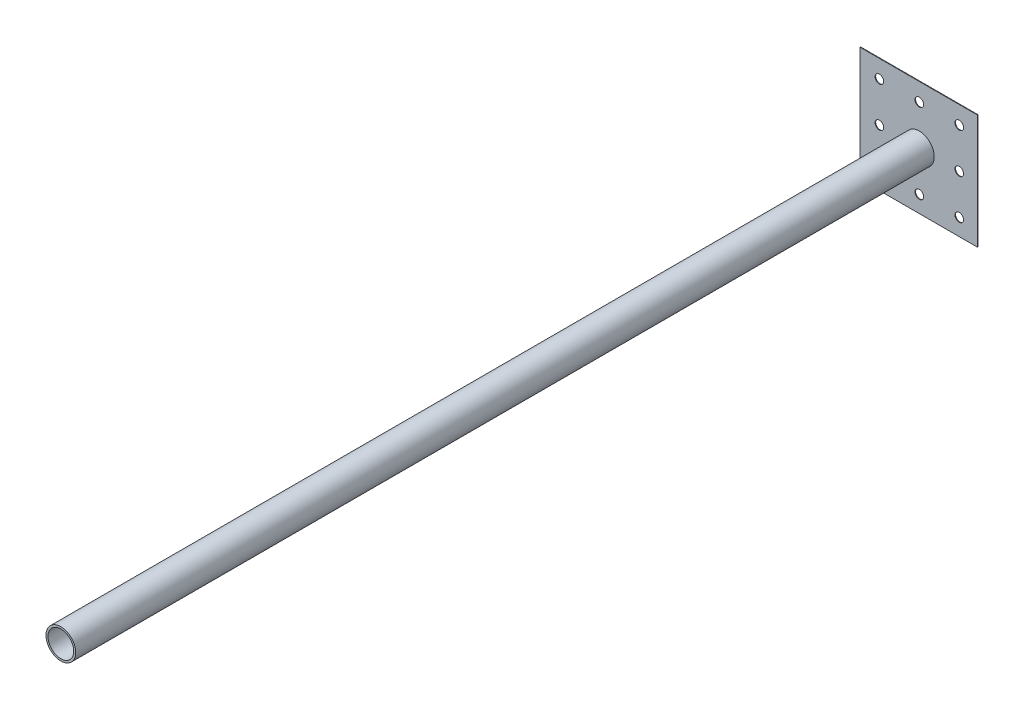
ISO-10303-21;
HEADER;
FILE_DESCRIPTION(('STEP AP214'),'2;1');
FILE_NAME('part.step','',(''),(''),'','','');
FILE_SCHEMA(('AUTOMOTIVE_DESIGN { 1 0 10303 214 1 1 1 1 }'));
ENDSEC;
DATA;
#1=APPLICATION_CONTEXT('core data for automotive mechanical design processes');
#2=APPLICATION_PROTOCOL_DEFINITION('international standard','automotive_design',2000,#1);
#3=PRODUCT_CONTEXT('',#1,'mechanical');
#4=PRODUCT('Part','Part','',(#3));
#5=PRODUCT_RELATED_PRODUCT_CATEGORY('part','',(#4));
#6=PRODUCT_DEFINITION_FORMATION('','',#4);
#7=PRODUCT_DEFINITION_CONTEXT('part definition',#1,'design');
#8=PRODUCT_DEFINITION('design','',#6,#7);
#9=PRODUCT_DEFINITION_SHAPE('','',#8);
#10=(LENGTH_UNIT() NAMED_UNIT(*) SI_UNIT(.MILLI.,.METRE.));
#11=(NAMED_UNIT(*) PLANE_ANGLE_UNIT() SI_UNIT($,.RADIAN.));
#12=(NAMED_UNIT(*) SI_UNIT($,.STERADIAN.) SOLID_ANGLE_UNIT());
#13=UNCERTAINTY_MEASURE_WITH_UNIT(LENGTH_MEASURE(1.E-05),#10,'distance_accuracy_value','');
#14=(GEOMETRIC_REPRESENTATION_CONTEXT(3) GLOBAL_UNCERTAINTY_ASSIGNED_CONTEXT((#13)) GLOBAL_UNIT_ASSIGNED_CONTEXT((#10,
#11,#12)) REPRESENTATION_CONTEXT('',''));
#15=CARTESIAN_POINT('',(0.,0.,0.));
#16=DIRECTION('',(0.,0.,1.));
#17=DIRECTION('',(1.,0.,0.));
#18=AXIS2_PLACEMENT_3D('',#15,#16,#17);
#19=CARTESIAN_POINT('',(0.,0.,0.2));
#20=DIRECTION('',(0.,0.,1.));
#21=DIRECTION('',(1.,0.,0.));
#22=AXIS2_PLACEMENT_3D('',#19,#20,#21);
#23=PLANE('',#22);
#24=DIRECTION('',(0.,-1.,0.));
#25=VECTOR('',#24,1.);
#26=CARTESIAN_POINT('',(0.,40.,0.2));
#27=LINE('',#26,#25);
#28=CARTESIAN_POINT('',(0.,40.,0.2));
#29=VERTEX_POINT('',#28);
#30=CARTESIAN_POINT('',(0.,0.,0.2));
#31=VERTEX_POINT('',#30);
#32=EDGE_CURVE('E92',#29,#31,#27,.T.);
#33=ORIENTED_EDGE('',*,*,#32,.T.);
#34=DIRECTION('',(1.,0.,0.));
#35=VECTOR('',#34,1.);
#36=CARTESIAN_POINT('',(0.,0.,0.2));
#37=LINE('',#36,#35);
#38=CARTESIAN_POINT('',(41.,0.,0.2));
#39=VERTEX_POINT('',#38);
#40=EDGE_CURVE('E87',#31,#39,#37,.T.);
#41=ORIENTED_EDGE('',*,*,#40,.T.);
#42=DIRECTION('',(0.,1.,0.));
#43=VECTOR('',#42,1.);
#44=CARTESIAN_POINT('',(41.,40.,0.2));
#45=LINE('',#44,#43);
#46=CARTESIAN_POINT('',(41.,40.,0.2));
#47=VERTEX_POINT('',#46);
#48=EDGE_CURVE('E90',#39,#47,#45,.T.);
#49=ORIENTED_EDGE('',*,*,#48,.T.);
#50=DIRECTION('',(-1.,0.,0.));
#51=VECTOR('',#50,1.);
#52=CARTESIAN_POINT('',(0.,40.,0.2));
#53=LINE('',#52,#51);
#54=EDGE_CURVE('E57',#47,#29,#53,.T.);
#55=ORIENTED_EDGE('',*,*,#54,.T.);
#56=EDGE_LOOP('',(#33,#41,#49,#55));
#57=FACE_BOUND('',#56,.T.);
#58=CARTESIAN_POINT('',(20.7000000000002,33.75,0.2));
#59=DIRECTION('',(0.,0.,1.));
#60=DIRECTION('',(1.,0.,0.));
#61=AXIS2_PLACEMENT_3D('',#58,#59,#60);
#62=CIRCLE('',#61,1.50000000000001);
#63=CARTESIAN_POINT('',(22.2000000000002,33.75,0.2));
#64=VERTEX_POINT('',#63);
#65=EDGE_CURVE('E133',#64,#64,#62,.T.);
#66=ORIENTED_EDGE('',*,*,#65,.F.);
#67=EDGE_LOOP('',(#66));
#68=FACE_BOUND('',#67,.T.);
#69=CARTESIAN_POINT('',(34.6499999999997,33.7499999999998,0.2));
#70=DIRECTION('',(0.,0.,1.));
#71=DIRECTION('',(1.,0.,0.));
#72=AXIS2_PLACEMENT_3D('',#69,#70,#71);
#73=CIRCLE('',#72,1.49999999999967);
#74=CARTESIAN_POINT('',(36.1499999999994,33.7499999999998,0.2));
#75=VERTEX_POINT('',#74);
#76=EDGE_CURVE('E137',#75,#75,#73,.T.);
#77=ORIENTED_EDGE('',*,*,#76,.F.);
#78=EDGE_LOOP('',(#77));
#79=FACE_BOUND('',#78,.T.);
#80=CARTESIAN_POINT('',(34.65,19.8,0.2));
#81=DIRECTION('',(0.,0.,1.));
#82=DIRECTION('',(1.,0.,0.));
#83=AXIS2_PLACEMENT_3D('',#80,#81,#82);
#84=CIRCLE('',#83,1.5);
#85=CARTESIAN_POINT('',(36.15,19.8,0.2));
#86=VERTEX_POINT('',#85);
#87=EDGE_CURVE('E186',#86,#86,#84,.T.);
#88=ORIENTED_EDGE('',*,*,#87,.F.);
#89=EDGE_LOOP('',(#88));
#90=FACE_BOUND('',#89,.T.);
#91=CARTESIAN_POINT('',(20.6999999999999,5.85000000000001,0.2));
#92=DIRECTION('',(0.,0.,1.));
#93=DIRECTION('',(1.,0.,0.));
#94=AXIS2_PLACEMENT_3D('',#91,#92,#93);
#95=CIRCLE('',#94,1.5);
#96=CARTESIAN_POINT('',(22.2,5.85000000000001,0.2));
#97=VERTEX_POINT('',#96);
#98=EDGE_CURVE('E178',#97,#97,#95,.T.);
#99=ORIENTED_EDGE('',*,*,#98,.F.);
#100=EDGE_LOOP('',(#99));
#101=FACE_BOUND('',#100,.T.);
#102=CARTESIAN_POINT('',(34.6499999999997,5.8499999999996,0.2));
#103=DIRECTION('',(0.,0.,1.));
#104=DIRECTION('',(1.,0.,0.));
#105=AXIS2_PLACEMENT_3D('',#102,#103,#104);
#106=CIRCLE('',#105,1.49999999999923);
#107=CARTESIAN_POINT('',(36.1499999999989,5.8499999999996,0.2));
#108=VERTEX_POINT('',#107);
#109=EDGE_CURVE('E170',#108,#108,#106,.T.);
#110=ORIENTED_EDGE('',*,*,#109,.F.);
#111=EDGE_LOOP('',(#110));
#112=FACE_BOUND('',#111,.T.);
#113=CARTESIAN_POINT('',(6.75,19.8000000000001,0.2));
#114=DIRECTION('',(0.,0.,1.));
#115=DIRECTION('',(1.,0.,0.));
#116=AXIS2_PLACEMENT_3D('',#113,#114,#115);
#117=CIRCLE('',#116,1.5);
#118=CARTESIAN_POINT('',(8.25,19.8000000000001,0.2));
#119=VERTEX_POINT('',#118);
#120=EDGE_CURVE('E146',#119,#119,#117,.T.);
#121=ORIENTED_EDGE('',*,*,#120,.F.);
#122=EDGE_LOOP('',(#121));
#123=FACE_BOUND('',#122,.T.);
#124=CARTESIAN_POINT('',(6.74999999999954,33.7499999999998,0.2));
#125=DIRECTION('',(0.,0.,1.));
#126=DIRECTION('',(1.,0.,0.));
#127=AXIS2_PLACEMENT_3D('',#124,#125,#126);
#128=CIRCLE('',#127,1.50000000000028);
#129=CARTESIAN_POINT('',(8.24999999999982,33.7499999999998,0.2));
#130=VERTEX_POINT('',#129);
#131=EDGE_CURVE('E145',#130,#130,#128,.T.);
#132=ORIENTED_EDGE('',*,*,#131,.F.);
#133=EDGE_LOOP('',(#132));
#134=FACE_BOUND('',#133,.T.);
#135=CARTESIAN_POINT('',(6.74999999999955,5.8499999999996,0.2));
#136=DIRECTION('',(0.,0.,1.));
#137=DIRECTION('',(1.,0.,0.));
#138=AXIS2_PLACEMENT_3D('',#135,#136,#137);
#139=CIRCLE('',#138,1.49999999999996);
#140=CARTESIAN_POINT('',(8.2499999999995,5.8499999999996,0.2));
#141=VERTEX_POINT('',#140);
#142=EDGE_CURVE('E154',#141,#141,#139,.T.);
#143=ORIENTED_EDGE('',*,*,#142,.F.);
#144=EDGE_LOOP('',(#143));
#145=FACE_BOUND('',#144,.T.);
#146=CARTESIAN_POINT('',(20.7,19.8,0.2));
#147=DIRECTION('',(0.,0.,1.));
#148=DIRECTION('',(1.,0.,0.));
#149=AXIS2_PLACEMENT_3D('',#146,#147,#148);
#150=CIRCLE('',#149,5.2);
#151=CARTESIAN_POINT('',(25.9,19.8,0.2));
#152=VERTEX_POINT('',#151);
#153=EDGE_CURVE('E197',#152,#152,#150,.T.);
#154=ORIENTED_EDGE('',*,*,#153,.F.);
#155=EDGE_LOOP('',(#154));
#156=FACE_BOUND('',#155,.T.);
#157=ADVANCED_FACE('F39',(#57,#68,#79,#90,#101,#112,#123,#134,#145,#156),#23,.T.);
#158=CARTESIAN_POINT('',(0.,40.,0.2));
#159=DIRECTION('',(1.,0.,0.));
#160=DIRECTION('',(0.,0.,-1.));
#161=AXIS2_PLACEMENT_3D('',#158,#159,#160);
#162=PLANE('',#161);
#163=DIRECTION('',(0.,-1.,0.));
#164=VECTOR('',#163,1.);
#165=CARTESIAN_POINT('',(0.,40.,0.));
#166=LINE('',#165,#164);
#167=CARTESIAN_POINT('',(0.,40.,0.));
#168=VERTEX_POINT('',#167);
#169=CARTESIAN_POINT('',(0.,0.,0.));
#170=VERTEX_POINT('',#169);
#171=EDGE_CURVE('E108',#168,#170,#166,.T.);
#172=ORIENTED_EDGE('',*,*,#171,.T.);
#173=DIRECTION('',(0.,0.,-1.));
#174=VECTOR('',#173,1.);
#175=CARTESIAN_POINT('',(0.,0.,0.2));
#176=LINE('',#175,#174);
#177=EDGE_CURVE('E11',#31,#170,#176,.T.);
#178=ORIENTED_EDGE('',*,*,#177,.F.);
#179=ORIENTED_EDGE('',*,*,#32,.F.);
#180=DIRECTION('',(0.,0.,-1.));
#181=VECTOR('',#180,1.);
#182=CARTESIAN_POINT('',(0.,40.,0.2));
#183=LINE('',#182,#181);
#184=EDGE_CURVE('E104',#29,#168,#183,.T.);
#185=ORIENTED_EDGE('',*,*,#184,.T.);
#186=EDGE_LOOP('',(#172,#178,#179,#185));
#187=FACE_BOUND('',#186,.T.);
#188=ADVANCED_FACE('F41',(#187),#162,.F.);
#189=CARTESIAN_POINT('',(0.,0.,0.2));
#190=DIRECTION('',(0.,1.,0.));
#191=DIRECTION('',(0.,0.,1.));
#192=AXIS2_PLACEMENT_3D('',#189,#190,#191);
#193=PLANE('',#192);
#194=DIRECTION('',(1.,0.,0.));
#195=VECTOR('',#194,1.);
#196=CARTESIAN_POINT('',(0.,0.,0.));
#197=LINE('',#196,#195);
#198=CARTESIAN_POINT('',(41.,0.,0.));
#199=VERTEX_POINT('',#198);
#200=EDGE_CURVE('E97',#170,#199,#197,.T.);
#201=ORIENTED_EDGE('',*,*,#200,.T.);
#202=DIRECTION('',(0.,0.,-1.));
#203=VECTOR('',#202,1.);
#204=CARTESIAN_POINT('',(41.,0.,0.2));
#205=LINE('',#204,#203);
#206=EDGE_CURVE('E49',#39,#199,#205,.T.);
#207=ORIENTED_EDGE('',*,*,#206,.F.);
#208=ORIENTED_EDGE('',*,*,#40,.F.);
#209=ORIENTED_EDGE('',*,*,#177,.T.);
#210=EDGE_LOOP('',(#201,#207,#208,#209));
#211=FACE_BOUND('',#210,.T.);
#212=ADVANCED_FACE('F96',(#211),#193,.F.);
#213=CARTESIAN_POINT('',(41.,40.,0.2));
#214=DIRECTION('',(-1.,0.,0.));
#215=DIRECTION('',(0.,0.,1.));
#216=AXIS2_PLACEMENT_3D('',#213,#214,#215);
#217=PLANE('',#216);
#218=DIRECTION('',(0.,1.,0.));
#219=VECTOR('',#218,1.);
#220=CARTESIAN_POINT('',(41.,40.,0.));
#221=LINE('',#220,#219);
#222=CARTESIAN_POINT('',(41.,40.,0.));
#223=VERTEX_POINT('',#222);
#224=EDGE_CURVE('E74',#199,#223,#221,.T.);
#225=ORIENTED_EDGE('',*,*,#224,.T.);
#226=DIRECTION('',(0.,0.,-1.));
#227=VECTOR('',#226,1.);
#228=CARTESIAN_POINT('',(41.,40.,0.2));
#229=LINE('',#228,#227);
#230=EDGE_CURVE('E99',#47,#223,#229,.T.);
#231=ORIENTED_EDGE('',*,*,#230,.F.);
#232=ORIENTED_EDGE('',*,*,#48,.F.);
#233=ORIENTED_EDGE('',*,*,#206,.T.);
#234=EDGE_LOOP('',(#225,#231,#232,#233));
#235=FACE_BOUND('',#234,.T.);
#236=ADVANCED_FACE('F100',(#235),#217,.F.);
#237=CARTESIAN_POINT('',(0.,40.,0.2));
#238=DIRECTION('',(0.,-1.,0.));
#239=DIRECTION('',(0.,0.,-1.));
#240=AXIS2_PLACEMENT_3D('',#237,#238,#239);
#241=PLANE('',#240);
#242=DIRECTION('',(-1.,0.,0.));
#243=VECTOR('',#242,1.);
#244=CARTESIAN_POINT('',(0.,40.,0.));
#245=LINE('',#244,#243);
#246=EDGE_CURVE('E80',#223,#168,#245,.T.);
#247=ORIENTED_EDGE('',*,*,#246,.T.);
#248=ORIENTED_EDGE('',*,*,#184,.F.);
#249=ORIENTED_EDGE('',*,*,#54,.F.);
#250=ORIENTED_EDGE('',*,*,#230,.T.);
#251=EDGE_LOOP('',(#247,#248,#249,#250));
#252=FACE_BOUND('',#251,.T.);
#253=ADVANCED_FACE('F122',(#252),#241,.F.);
#254=CARTESIAN_POINT('',(0.,0.,0.));
#255=DIRECTION('',(0.,0.,1.));
#256=DIRECTION('',(1.,0.,0.));
#257=AXIS2_PLACEMENT_3D('',#254,#255,#256);
#258=PLANE('',#257);
#259=CARTESIAN_POINT('',(6.74999999999955,5.8499999999996,0.));
#260=DIRECTION('',(0.,0.,1.));
#261=DIRECTION('',(1.,0.,0.));
#262=AXIS2_PLACEMENT_3D('',#259,#260,#261);
#263=CIRCLE('',#262,1.49999999999996);
#264=CARTESIAN_POINT('',(8.2499999999995,5.8499999999996,0.));
#265=VERTEX_POINT('',#264);
#266=EDGE_CURVE('E150',#265,#265,#263,.T.);
#267=ORIENTED_EDGE('',*,*,#266,.T.);
#268=EDGE_LOOP('',(#267));
#269=FACE_BOUND('',#268,.T.);
#270=CARTESIAN_POINT('',(6.74999999999954,33.7499999999998,0.));
#271=DIRECTION('',(0.,0.,1.));
#272=DIRECTION('',(1.,0.,0.));
#273=AXIS2_PLACEMENT_3D('',#270,#271,#272);
#274=CIRCLE('',#273,1.50000000000028);
#275=CARTESIAN_POINT('',(8.24999999999982,33.7499999999998,0.));
#276=VERTEX_POINT('',#275);
#277=EDGE_CURVE('E141',#276,#276,#274,.T.);
#278=ORIENTED_EDGE('',*,*,#277,.T.);
#279=EDGE_LOOP('',(#278));
#280=FACE_BOUND('',#279,.T.);
#281=CARTESIAN_POINT('',(6.75,19.8000000000001,0.));
#282=DIRECTION('',(0.,0.,1.));
#283=DIRECTION('',(1.,0.,0.));
#284=AXIS2_PLACEMENT_3D('',#281,#282,#283);
#285=CIRCLE('',#284,1.5);
#286=CARTESIAN_POINT('',(8.25,19.8000000000001,0.));
#287=VERTEX_POINT('',#286);
#288=EDGE_CURVE('E159',#287,#287,#285,.T.);
#289=ORIENTED_EDGE('',*,*,#288,.T.);
#290=EDGE_LOOP('',(#289));
#291=FACE_BOUND('',#290,.T.);
#292=CARTESIAN_POINT('',(34.6499999999997,5.8499999999996,0.));
#293=DIRECTION('',(0.,0.,1.));
#294=DIRECTION('',(1.,0.,0.));
#295=AXIS2_PLACEMENT_3D('',#292,#293,#294);
#296=CIRCLE('',#295,1.49999999999923);
#297=CARTESIAN_POINT('',(36.1499999999989,5.8499999999996,0.));
#298=VERTEX_POINT('',#297);
#299=EDGE_CURVE('E158',#298,#298,#296,.T.);
#300=ORIENTED_EDGE('',*,*,#299,.T.);
#301=EDGE_LOOP('',(#300));
#302=FACE_BOUND('',#301,.T.);
#303=CARTESIAN_POINT('',(20.6999999999999,5.85000000000001,0.));
#304=DIRECTION('',(0.,0.,1.));
#305=DIRECTION('',(1.,0.,0.));
#306=AXIS2_PLACEMENT_3D('',#303,#304,#305);
#307=CIRCLE('',#306,1.5);
#308=CARTESIAN_POINT('',(22.2,5.85000000000001,0.));
#309=VERTEX_POINT('',#308);
#310=EDGE_CURVE('E174',#309,#309,#307,.T.);
#311=ORIENTED_EDGE('',*,*,#310,.T.);
#312=EDGE_LOOP('',(#311));
#313=FACE_BOUND('',#312,.T.);
#314=CARTESIAN_POINT('',(34.65,19.8,0.));
#315=DIRECTION('',(0.,0.,1.));
#316=DIRECTION('',(1.,0.,0.));
#317=AXIS2_PLACEMENT_3D('',#314,#315,#316);
#318=CIRCLE('',#317,1.5);
#319=CARTESIAN_POINT('',(36.15,19.8,0.));
#320=VERTEX_POINT('',#319);
#321=EDGE_CURVE('E182',#320,#320,#318,.T.);
#322=ORIENTED_EDGE('',*,*,#321,.T.);
#323=EDGE_LOOP('',(#322));
#324=FACE_BOUND('',#323,.T.);
#325=CARTESIAN_POINT('',(34.6499999999997,33.7499999999998,0.));
#326=DIRECTION('',(0.,0.,1.));
#327=DIRECTION('',(1.,0.,0.));
#328=AXIS2_PLACEMENT_3D('',#325,#326,#327);
#329=CIRCLE('',#328,1.49999999999967);
#330=CARTESIAN_POINT('',(36.1499999999994,33.7499999999998,0.));
#331=VERTEX_POINT('',#330);
#332=EDGE_CURVE('E190',#331,#331,#329,.T.);
#333=ORIENTED_EDGE('',*,*,#332,.T.);
#334=EDGE_LOOP('',(#333));
#335=FACE_BOUND('',#334,.T.);
#336=CARTESIAN_POINT('',(20.7000000000002,33.75,0.));
#337=DIRECTION('',(0.,0.,1.));
#338=DIRECTION('',(1.,0.,0.));
#339=AXIS2_PLACEMENT_3D('',#336,#337,#338);
#340=CIRCLE('',#339,1.50000000000001);
#341=CARTESIAN_POINT('',(22.2000000000002,33.75,0.));
#342=VERTEX_POINT('',#341);
#343=EDGE_CURVE('E132',#342,#342,#340,.T.);
#344=ORIENTED_EDGE('',*,*,#343,.T.);
#345=EDGE_LOOP('',(#344));
#346=FACE_BOUND('',#345,.T.);
#347=CARTESIAN_POINT('',(20.7,19.8,0.));
#348=DIRECTION('',(0.,0.,1.));
#349=DIRECTION('',(1.,0.,0.));
#350=AXIS2_PLACEMENT_3D('',#347,#348,#349);
#351=CIRCLE('',#350,4.5);
#352=CARTESIAN_POINT('',(25.2,19.8,0.));
#353=VERTEX_POINT('',#352);
#354=EDGE_CURVE('E112',#353,#353,#351,.T.);
#355=ORIENTED_EDGE('',*,*,#354,.T.);
#356=EDGE_LOOP('',(#355));
#357=FACE_BOUND('',#356,.T.);
#358=ORIENTED_EDGE('',*,*,#171,.F.);
#359=ORIENTED_EDGE('',*,*,#246,.F.);
#360=ORIENTED_EDGE('',*,*,#224,.F.);
#361=ORIENTED_EDGE('',*,*,#200,.F.);
#362=EDGE_LOOP('',(#358,#359,#360,#361));
#363=FACE_BOUND('',#362,.T.);
#364=ADVANCED_FACE('F125',(#269,#280,#291,#302,#313,#324,#335,#346,#357,#363),#258,.F.);
#365=CARTESIAN_POINT('',(20.7,19.8,0.));
#366=DIRECTION('',(0.,0.,1.));
#367=DIRECTION('',(1.,0.,0.));
#368=AXIS2_PLACEMENT_3D('',#365,#366,#367);
#369=CYLINDRICAL_SURFACE('',#368,4.5);
#370=ORIENTED_EDGE('',*,*,#354,.F.);
#371=EDGE_LOOP('',(#370));
#372=FACE_BOUND('',#371,.T.);
#373=CARTESIAN_POINT('',(20.7,19.8,300.2));
#374=DIRECTION('',(0.,0.,1.));
#375=DIRECTION('',(1.,0.,0.));
#376=AXIS2_PLACEMENT_3D('',#373,#374,#375);
#377=CIRCLE('',#376,4.5);
#378=CARTESIAN_POINT('',(25.2,19.8,300.2));
#379=VERTEX_POINT('',#378);
#380=EDGE_CURVE('E201',#379,#379,#377,.T.);
#381=ORIENTED_EDGE('',*,*,#380,.T.);
#382=EDGE_LOOP('',(#381));
#383=FACE_BOUND('',#382,.T.);
#384=ADVANCED_FACE('F209',(#372,#383),#369,.F.);
#385=CARTESIAN_POINT('',(20.7000000000002,33.75,0.));
#386=DIRECTION('',(0.,0.,1.));
#387=DIRECTION('',(1.,0.,0.));
#388=AXIS2_PLACEMENT_3D('',#385,#386,#387);
#389=CYLINDRICAL_SURFACE('',#388,1.50000000000001);
#390=ORIENTED_EDGE('',*,*,#343,.F.);
#391=EDGE_LOOP('',(#390));
#392=FACE_BOUND('',#391,.T.);
#393=ORIENTED_EDGE('',*,*,#65,.T.);
#394=EDGE_LOOP('',(#393));
#395=FACE_BOUND('',#394,.T.);
#396=ADVANCED_FACE('F264',(#392,#395),#389,.F.);
#397=CARTESIAN_POINT('',(34.6499999999997,33.7499999999998,0.));
#398=DIRECTION('',(0.,0.,1.));
#399=DIRECTION('',(1.,0.,0.));
#400=AXIS2_PLACEMENT_3D('',#397,#398,#399);
#401=CYLINDRICAL_SURFACE('',#400,1.49999999999967);
#402=ORIENTED_EDGE('',*,*,#332,.F.);
#403=EDGE_LOOP('',(#402));
#404=FACE_BOUND('',#403,.T.);
#405=ORIENTED_EDGE('',*,*,#76,.T.);
#406=EDGE_LOOP('',(#405));
#407=FACE_BOUND('',#406,.T.);
#408=ADVANCED_FACE('F267',(#404,#407),#401,.F.);
#409=CARTESIAN_POINT('',(34.65,19.8,0.));
#410=DIRECTION('',(0.,0.,1.));
#411=DIRECTION('',(1.,0.,0.));
#412=AXIS2_PLACEMENT_3D('',#409,#410,#411);
#413=CYLINDRICAL_SURFACE('',#412,1.5);
#414=ORIENTED_EDGE('',*,*,#321,.F.);
#415=EDGE_LOOP('',(#414));
#416=FACE_BOUND('',#415,.T.);
#417=ORIENTED_EDGE('',*,*,#87,.T.);
#418=EDGE_LOOP('',(#417));
#419=FACE_BOUND('',#418,.T.);
#420=ADVANCED_FACE('F274',(#416,#419),#413,.F.);
#421=CARTESIAN_POINT('',(20.6999999999999,5.85000000000001,0.));
#422=DIRECTION('',(0.,0.,1.));
#423=DIRECTION('',(1.,0.,0.));
#424=AXIS2_PLACEMENT_3D('',#421,#422,#423);
#425=CYLINDRICAL_SURFACE('',#424,1.5);
#426=ORIENTED_EDGE('',*,*,#310,.F.);
#427=EDGE_LOOP('',(#426));
#428=FACE_BOUND('',#427,.T.);
#429=ORIENTED_EDGE('',*,*,#98,.T.);
#430=EDGE_LOOP('',(#429));
#431=FACE_BOUND('',#430,.T.);
#432=ADVANCED_FACE('F282',(#428,#431),#425,.F.);
#433=CARTESIAN_POINT('',(34.6499999999997,5.8499999999996,0.));
#434=DIRECTION('',(0.,0.,1.));
#435=DIRECTION('',(1.,0.,0.));
#436=AXIS2_PLACEMENT_3D('',#433,#434,#435);
#437=CYLINDRICAL_SURFACE('',#436,1.49999999999923);
#438=ORIENTED_EDGE('',*,*,#299,.F.);
#439=EDGE_LOOP('',(#438));
#440=FACE_BOUND('',#439,.T.);
#441=ORIENTED_EDGE('',*,*,#109,.T.);
#442=EDGE_LOOP('',(#441));
#443=FACE_BOUND('',#442,.T.);
#444=ADVANCED_FACE('F290',(#440,#443),#437,.F.);
#445=CARTESIAN_POINT('',(6.75,19.8000000000001,0.));
#446=DIRECTION('',(0.,0.,1.));
#447=DIRECTION('',(1.,0.,0.));
#448=AXIS2_PLACEMENT_3D('',#445,#446,#447);
#449=CYLINDRICAL_SURFACE('',#448,1.5);
#450=ORIENTED_EDGE('',*,*,#288,.F.);
#451=EDGE_LOOP('',(#450));
#452=FACE_BOUND('',#451,.T.);
#453=ORIENTED_EDGE('',*,*,#120,.T.);
#454=EDGE_LOOP('',(#453));
#455=FACE_BOUND('',#454,.T.);
#456=ADVANCED_FACE('F298',(#452,#455),#449,.F.);
#457=CARTESIAN_POINT('',(6.74999999999954,33.7499999999998,0.));
#458=DIRECTION('',(0.,0.,1.));
#459=DIRECTION('',(1.,0.,0.));
#460=AXIS2_PLACEMENT_3D('',#457,#458,#459);
#461=CYLINDRICAL_SURFACE('',#460,1.50000000000028);
#462=ORIENTED_EDGE('',*,*,#277,.F.);
#463=EDGE_LOOP('',(#462));
#464=FACE_BOUND('',#463,.T.);
#465=ORIENTED_EDGE('',*,*,#131,.T.);
#466=EDGE_LOOP('',(#465));
#467=FACE_BOUND('',#466,.T.);
#468=ADVANCED_FACE('F224',(#464,#467),#461,.F.);
#469=CARTESIAN_POINT('',(6.74999999999955,5.8499999999996,0.));
#470=DIRECTION('',(0.,0.,1.));
#471=DIRECTION('',(1.,0.,0.));
#472=AXIS2_PLACEMENT_3D('',#469,#470,#471);
#473=CYLINDRICAL_SURFACE('',#472,1.49999999999996);
#474=ORIENTED_EDGE('',*,*,#266,.F.);
#475=EDGE_LOOP('',(#474));
#476=FACE_BOUND('',#475,.T.);
#477=ORIENTED_EDGE('',*,*,#142,.T.);
#478=EDGE_LOOP('',(#477));
#479=FACE_BOUND('',#478,.T.);
#480=ADVANCED_FACE('F214',(#476,#479),#473,.F.);
#481=CARTESIAN_POINT('',(20.7,19.8,300.2));
#482=DIRECTION('',(0.,0.,1.));
#483=DIRECTION('',(1.,0.,0.));
#484=AXIS2_PLACEMENT_3D('',#481,#482,#483);
#485=PLANE('',#484);
#486=CARTESIAN_POINT('',(20.7,19.8,300.2));
#487=DIRECTION('',(0.,0.,1.));
#488=DIRECTION('',(1.,0.,0.));
#489=AXIS2_PLACEMENT_3D('',#486,#487,#488);
#490=CIRCLE('',#489,5.2);
#491=CARTESIAN_POINT('',(25.9,19.8,300.2));
#492=VERTEX_POINT('',#491);
#493=EDGE_CURVE('E163',#492,#492,#490,.T.);
#494=ORIENTED_EDGE('',*,*,#493,.T.);
#495=EDGE_LOOP('',(#494));
#496=FACE_BOUND('',#495,.T.);
#497=ORIENTED_EDGE('',*,*,#380,.F.);
#498=EDGE_LOOP('',(#497));
#499=FACE_BOUND('',#498,.T.);
#500=ADVANCED_FACE('F211',(#496,#499),#485,.T.);
#501=CARTESIAN_POINT('',(20.7,19.8,300.2));
#502=DIRECTION('',(0.,0.,-1.));
#503=DIRECTION('',(-1.,0.,0.));
#504=AXIS2_PLACEMENT_3D('',#501,#502,#503);
#505=CYLINDRICAL_SURFACE('',#504,5.2);
#506=ORIENTED_EDGE('',*,*,#493,.F.);
#507=EDGE_LOOP('',(#506));
#508=FACE_BOUND('',#507,.T.);
#509=ORIENTED_EDGE('',*,*,#153,.T.);
#510=EDGE_LOOP('',(#509));
#511=FACE_BOUND('',#510,.T.);
#512=ADVANCED_FACE('F213',(#508,#511),#505,.T.);
#513=CLOSED_SHELL('',(#157,#188,#212,#236,#253,#364,#384,#396,#408,#420,#432,#444,#456,#468,
#480,#500,#512));
#514=MANIFOLD_SOLID_BREP('B2',#513);
#515=ADVANCED_BREP_SHAPE_REPRESENTATION('',(#18,#514),#14);
#516=SHAPE_DEFINITION_REPRESENTATION(#9,#515);
ENDSEC;
END-ISO-10303-21;
